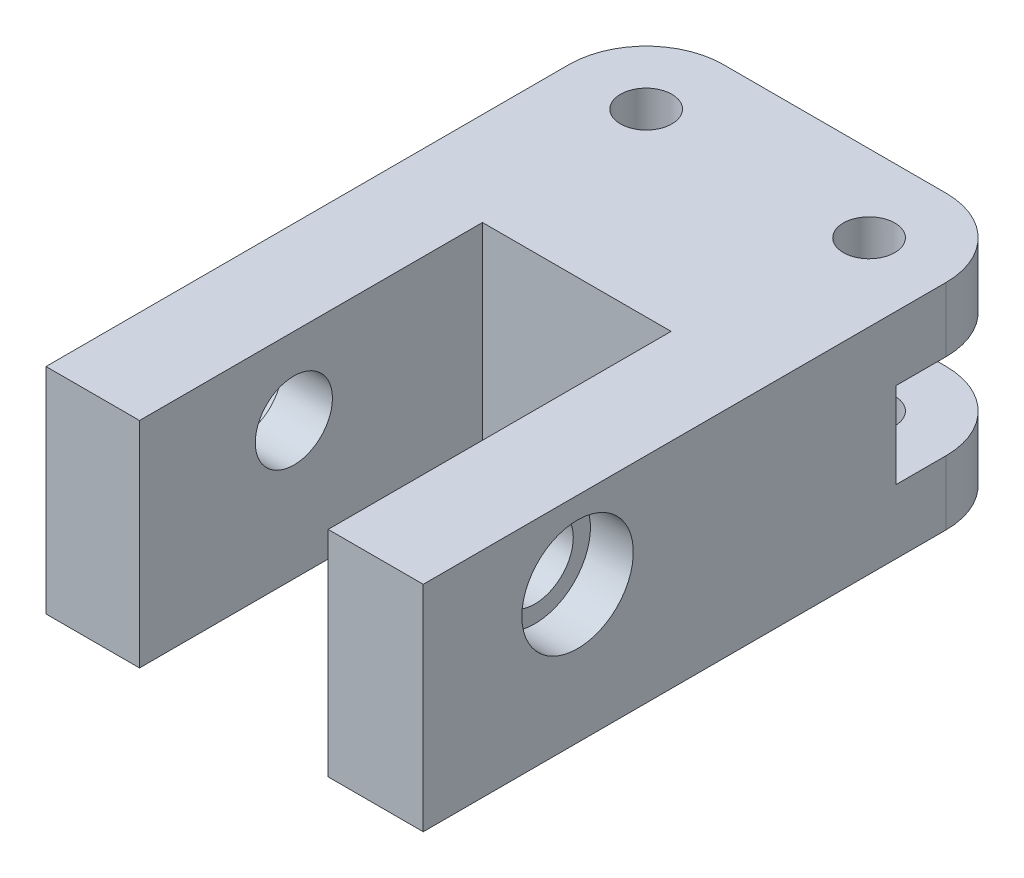
ISO-10303-21;
HEADER;
FILE_DESCRIPTION(('STEP AP214'),'2;1');
FILE_NAME('part.step','',(''),(''),'','','');
FILE_SCHEMA(('AUTOMOTIVE_DESIGN { 1 0 10303 214 1 1 1 1 }'));
ENDSEC;
DATA;
#1=APPLICATION_CONTEXT('core data for automotive mechanical design processes');
#2=APPLICATION_PROTOCOL_DEFINITION('international standard','automotive_design',2000,#1);
#3=PRODUCT_CONTEXT('',#1,'mechanical');
#4=PRODUCT('Part','Part','',(#3));
#5=PRODUCT_RELATED_PRODUCT_CATEGORY('part','',(#4));
#6=PRODUCT_DEFINITION_FORMATION('','',#4);
#7=PRODUCT_DEFINITION_CONTEXT('part definition',#1,'design');
#8=PRODUCT_DEFINITION('design','',#6,#7);
#9=PRODUCT_DEFINITION_SHAPE('','',#8);
#10=(LENGTH_UNIT() NAMED_UNIT(*) SI_UNIT(.MILLI.,.METRE.));
#11=(NAMED_UNIT(*) PLANE_ANGLE_UNIT() SI_UNIT($,.RADIAN.));
#12=(NAMED_UNIT(*) SI_UNIT($,.STERADIAN.) SOLID_ANGLE_UNIT());
#13=UNCERTAINTY_MEASURE_WITH_UNIT(LENGTH_MEASURE(1.E-05),#10,'distance_accuracy_value','');
#14=(GEOMETRIC_REPRESENTATION_CONTEXT(3) GLOBAL_UNCERTAINTY_ASSIGNED_CONTEXT((#13)) GLOBAL_UNIT_ASSIGNED_CONTEXT((#10,
#11,#12)) REPRESENTATION_CONTEXT('',''));
#15=CARTESIAN_POINT('',(0.,0.,0.));
#16=DIRECTION('',(0.,0.,1.));
#17=DIRECTION('',(1.,0.,0.));
#18=AXIS2_PLACEMENT_3D('',#15,#16,#17);
#19=CARTESIAN_POINT('',(-22.,-12.5,70.));
#20=DIRECTION('',(1.,0.,0.));
#21=DIRECTION('',(0.,0.,-1.));
#22=AXIS2_PLACEMENT_3D('',#19,#20,#21);
#23=PLANE('',#22);
#24=CARTESIAN_POINT('',(-22.,3.5,52.));
#25=DIRECTION('',(-1.,0.,0.));
#26=DIRECTION('',(0.,0.,1.));
#27=AXIS2_PLACEMENT_3D('',#24,#25,#26);
#28=CIRCLE('',#27,6.49999999999999);
#29=CARTESIAN_POINT('',(-22.,3.5,58.5));
#30=VERTEX_POINT('',#29);
#31=EDGE_CURVE('E288',#30,#30,#28,.T.);
#32=ORIENTED_EDGE('',*,*,#31,.F.);
#33=EDGE_LOOP('',(#32));
#34=FACE_BOUND('',#33,.T.);
#35=DIRECTION('',(0.,0.,1.));
#36=VECTOR('',#35,1.);
#37=CARTESIAN_POINT('',(-22.,5.,14.8492424049175));
#38=LINE('',#37,#36);
#39=CARTESIAN_POINT('',(-22.,5.,9.));
#40=VERTEX_POINT('',#39);
#41=CARTESIAN_POINT('',(-22.,5.,14.8492424049175));
#42=VERTEX_POINT('',#41);
#43=EDGE_CURVE('E242',#40,#42,#38,.T.);
#44=ORIENTED_EDGE('',*,*,#43,.T.);
#45=DIRECTION('',(0.,-1.,0.));
#46=VECTOR('',#45,1.);
#47=CARTESIAN_POINT('',(-22.,5.,14.8492424049175));
#48=LINE('',#47,#46);
#49=CARTESIAN_POINT('',(-22.,-5.,14.8492424049175));
#50=VERTEX_POINT('',#49);
#51=EDGE_CURVE('E245',#42,#50,#48,.T.);
#52=ORIENTED_EDGE('',*,*,#51,.T.);
#53=DIRECTION('',(0.,0.,1.));
#54=VECTOR('',#53,1.);
#55=CARTESIAN_POINT('',(-22.,-5.,14.8492424049175));
#56=LINE('',#55,#54);
#57=CARTESIAN_POINT('',(-22.,-5.,9.));
#58=VERTEX_POINT('',#57);
#59=EDGE_CURVE('E232',#58,#50,#56,.T.);
#60=ORIENTED_EDGE('',*,*,#59,.F.);
#61=DIRECTION('',(0.,1.,0.));
#62=VECTOR('',#61,1.);
#63=CARTESIAN_POINT('',(-22.,-16.5,9.));
#64=LINE('',#63,#62);
#65=CARTESIAN_POINT('',(-22.,-12.5,9.));
#66=VERTEX_POINT('',#65);
#67=EDGE_CURVE('E275',#66,#58,#64,.T.);
#68=ORIENTED_EDGE('',*,*,#67,.F.);
#69=DIRECTION('',(0.,0.,-1.));
#70=VECTOR('',#69,1.);
#71=CARTESIAN_POINT('',(-22.,-12.5,70.));
#72=LINE('',#71,#70);
#73=CARTESIAN_POINT('',(-22.,-12.5,70.));
#74=VERTEX_POINT('',#73);
#75=EDGE_CURVE('E363',#74,#66,#72,.T.);
#76=ORIENTED_EDGE('',*,*,#75,.F.);
#77=DIRECTION('',(0.,-1.,0.));
#78=VECTOR('',#77,1.);
#79=CARTESIAN_POINT('',(-22.,-12.5,70.));
#80=LINE('',#79,#78);
#81=CARTESIAN_POINT('',(-22.,12.5,70.));
#82=VERTEX_POINT('',#81);
#83=EDGE_CURVE('E351',#82,#74,#80,.T.);
#84=ORIENTED_EDGE('',*,*,#83,.F.);
#85=DIRECTION('',(0.,0.,-1.));
#86=VECTOR('',#85,1.);
#87=CARTESIAN_POINT('',(-22.,12.5,70.));
#88=LINE('',#87,#86);
#89=CARTESIAN_POINT('',(-22.,12.5,9.));
#90=VERTEX_POINT('',#89);
#91=EDGE_CURVE('E366',#82,#90,#88,.T.);
#92=ORIENTED_EDGE('',*,*,#91,.T.);
#93=EDGE_CURVE('E274',#40,#90,#64,.T.);
#94=ORIENTED_EDGE('',*,*,#93,.F.);
#95=EDGE_LOOP('',(#44,#52,#60,#68,#76,#84,#92,#94));
#96=FACE_BOUND('',#95,.T.);
#97=ADVANCED_FACE('F34',(#34,#96),#23,.F.);
#98=CARTESIAN_POINT('',(0.,0.,0.));
#99=DIRECTION('',(0.,0.,-1.));
#100=DIRECTION('',(-1.,0.,0.));
#101=AXIS2_PLACEMENT_3D('',#98,#99,#100);
#102=PLANE('',#101);
#103=DIRECTION('',(0.,1.,0.));
#104=VECTOR('',#103,1.);
#105=CARTESIAN_POINT('',(13.,0.,0.));
#106=LINE('',#105,#104);
#107=CARTESIAN_POINT('',(13.,5.,0.));
#108=VERTEX_POINT('',#107);
#109=CARTESIAN_POINT('',(13.,12.5,0.));
#110=VERTEX_POINT('',#109);
#111=EDGE_CURVE('E372',#108,#110,#106,.T.);
#112=ORIENTED_EDGE('',*,*,#111,.F.);
#113=DIRECTION('',(-1.,0.,0.));
#114=VECTOR('',#113,1.);
#115=CARTESIAN_POINT('',(0.,5.,0.));
#116=LINE('',#115,#114);
#117=CARTESIAN_POINT('',(2.5,5.,0.));
#118=VERTEX_POINT('',#117);
#119=EDGE_CURVE('E268',#108,#118,#116,.T.);
#120=ORIENTED_EDGE('',*,*,#119,.T.);
#121=DIRECTION('',(0.,-1.,0.));
#122=VECTOR('',#121,1.);
#123=CARTESIAN_POINT('',(2.5,0.,0.));
#124=LINE('',#123,#122);
#125=CARTESIAN_POINT('',(2.5,-5.,0.));
#126=VERTEX_POINT('',#125);
#127=EDGE_CURVE('E11',#118,#126,#124,.T.);
#128=ORIENTED_EDGE('',*,*,#127,.T.);
#129=DIRECTION('',(-1.,0.,0.));
#130=VECTOR('',#129,1.);
#131=CARTESIAN_POINT('',(0.,-5.,0.));
#132=LINE('',#131,#130);
#133=CARTESIAN_POINT('',(13.,-5.,0.));
#134=VERTEX_POINT('',#133);
#135=EDGE_CURVE('E191',#134,#126,#132,.T.);
#136=ORIENTED_EDGE('',*,*,#135,.F.);
#137=CARTESIAN_POINT('',(13.,-12.5,0.));
#138=VERTEX_POINT('',#137);
#139=EDGE_CURVE('E377',#138,#134,#106,.T.);
#140=ORIENTED_EDGE('',*,*,#139,.F.);
#141=DIRECTION('',(1.,0.,0.));
#142=VECTOR('',#141,1.);
#143=CARTESIAN_POINT('',(-22.,-12.5,0.));
#144=LINE('',#143,#142);
#145=CARTESIAN_POINT('',(-13.,-12.5,0.));
#146=VERTEX_POINT('',#145);
#147=EDGE_CURVE('E347',#146,#138,#144,.T.);
#148=ORIENTED_EDGE('',*,*,#147,.F.);
#149=DIRECTION('',(0.,1.,0.));
#150=VECTOR('',#149,1.);
#151=CARTESIAN_POINT('',(-13.,0.,0.));
#152=LINE('',#151,#150);
#153=CARTESIAN_POINT('',(-13.,-5.,0.));
#154=VERTEX_POINT('',#153);
#155=EDGE_CURVE('E385',#146,#154,#152,.T.);
#156=ORIENTED_EDGE('',*,*,#155,.T.);
#157=DIRECTION('',(-1.,0.,0.));
#158=VECTOR('',#157,1.);
#159=CARTESIAN_POINT('',(0.,-5.,0.));
#160=LINE('',#159,#158);
#161=CARTESIAN_POINT('',(-2.5,-5.,0.));
#162=VERTEX_POINT('',#161);
#163=EDGE_CURVE('E57',#162,#154,#160,.T.);
#164=ORIENTED_EDGE('',*,*,#163,.F.);
#165=DIRECTION('',(0.,1.,0.));
#166=VECTOR('',#165,1.);
#167=CARTESIAN_POINT('',(-2.5,0.,0.));
#168=LINE('',#167,#166);
#169=CARTESIAN_POINT('',(-2.5,5.,0.));
#170=VERTEX_POINT('',#169);
#171=EDGE_CURVE('E42',#162,#170,#168,.T.);
#172=ORIENTED_EDGE('',*,*,#171,.T.);
#173=DIRECTION('',(-1.,0.,0.));
#174=VECTOR('',#173,1.);
#175=CARTESIAN_POINT('',(0.,5.,0.));
#176=LINE('',#175,#174);
#177=CARTESIAN_POINT('',(-13.,5.,0.));
#178=VERTEX_POINT('',#177);
#179=EDGE_CURVE('E258',#170,#178,#176,.T.);
#180=ORIENTED_EDGE('',*,*,#179,.T.);
#181=CARTESIAN_POINT('',(-13.,12.5,0.));
#182=VERTEX_POINT('',#181);
#183=EDGE_CURVE('E380',#178,#182,#152,.T.);
#184=ORIENTED_EDGE('',*,*,#183,.T.);
#185=DIRECTION('',(-1.,0.,0.));
#186=VECTOR('',#185,1.);
#187=CARTESIAN_POINT('',(-22.,12.5,0.));
#188=LINE('',#187,#186);
#189=EDGE_CURVE('E335',#110,#182,#188,.T.);
#190=ORIENTED_EDGE('',*,*,#189,.F.);
#191=EDGE_LOOP('',(#112,#120,#128,#136,#140,#148,#156,#164,#172,#180,#184,#190));
#192=FACE_BOUND('',#191,.T.);
#193=ADVANCED_FACE('F400',(#192),#102,.T.);
#194=CARTESIAN_POINT('',(22.,-12.5,70.));
#195=DIRECTION('',(-1.,0.,0.));
#196=DIRECTION('',(0.,0.,1.));
#197=AXIS2_PLACEMENT_3D('',#194,#195,#196);
#198=PLANE('',#197);
#199=CARTESIAN_POINT('',(22.,3.5,52.));
#200=DIRECTION('',(-1.,0.,0.));
#201=DIRECTION('',(0.,0.,1.));
#202=AXIS2_PLACEMENT_3D('',#199,#200,#201);
#203=CIRCLE('',#202,6.49999999999999);
#204=CARTESIAN_POINT('',(22.,3.5,58.5));
#205=VERTEX_POINT('',#204);
#206=EDGE_CURVE('E309',#205,#205,#203,.T.);
#207=ORIENTED_EDGE('',*,*,#206,.T.);
#208=EDGE_LOOP('',(#207));
#209=FACE_BOUND('',#208,.T.);
#210=DIRECTION('',(0.,0.,-1.));
#211=VECTOR('',#210,1.);
#212=CARTESIAN_POINT('',(22.,5.,14.8492424049175));
#213=LINE('',#212,#211);
#214=CARTESIAN_POINT('',(22.,5.,14.8492424049175));
#215=VERTEX_POINT('',#214);
#216=CARTESIAN_POINT('',(22.,5.,9.));
#217=VERTEX_POINT('',#216);
#218=EDGE_CURVE('E218',#215,#217,#213,.T.);
#219=ORIENTED_EDGE('',*,*,#218,.T.);
#220=DIRECTION('',(0.,1.,0.));
#221=VECTOR('',#220,1.);
#222=CARTESIAN_POINT('',(22.,-16.5,9.));
#223=LINE('',#222,#221);
#224=CARTESIAN_POINT('',(22.,12.5,9.));
#225=VERTEX_POINT('',#224);
#226=EDGE_CURVE('E294',#217,#225,#223,.T.);
#227=ORIENTED_EDGE('',*,*,#226,.T.);
#228=DIRECTION('',(0.,0.,-1.));
#229=VECTOR('',#228,1.);
#230=CARTESIAN_POINT('',(22.,12.5,70.));
#231=LINE('',#230,#229);
#232=CARTESIAN_POINT('',(22.,12.5,70.));
#233=VERTEX_POINT('',#232);
#234=EDGE_CURVE('E369',#233,#225,#231,.T.);
#235=ORIENTED_EDGE('',*,*,#234,.F.);
#236=DIRECTION('',(0.,1.,0.));
#237=VECTOR('',#236,1.);
#238=CARTESIAN_POINT('',(22.,-12.5,70.));
#239=LINE('',#238,#237);
#240=CARTESIAN_POINT('',(22.,-12.5,70.));
#241=VERTEX_POINT('',#240);
#242=EDGE_CURVE('E343',#241,#233,#239,.T.);
#243=ORIENTED_EDGE('',*,*,#242,.F.);
#244=DIRECTION('',(0.,0.,-1.));
#245=VECTOR('',#244,1.);
#246=CARTESIAN_POINT('',(22.,-12.5,70.));
#247=LINE('',#246,#245);
#248=CARTESIAN_POINT('',(22.,-12.5,9.));
#249=VERTEX_POINT('',#248);
#250=EDGE_CURVE('E357',#241,#249,#247,.T.);
#251=ORIENTED_EDGE('',*,*,#250,.T.);
#252=CARTESIAN_POINT('',(22.,-5.,9.));
#253=VERTEX_POINT('',#252);
#254=EDGE_CURVE('E295',#249,#253,#223,.T.);
#255=ORIENTED_EDGE('',*,*,#254,.T.);
#256=DIRECTION('',(0.,0.,-1.));
#257=VECTOR('',#256,1.);
#258=CARTESIAN_POINT('',(22.,-5.,14.8492424049175));
#259=LINE('',#258,#257);
#260=CARTESIAN_POINT('',(22.,-5.,14.8492424049175));
#261=VERTEX_POINT('',#260);
#262=EDGE_CURVE('E49',#261,#253,#259,.T.);
#263=ORIENTED_EDGE('',*,*,#262,.F.);
#264=DIRECTION('',(0.,-1.,0.));
#265=VECTOR('',#264,1.);
#266=CARTESIAN_POINT('',(22.,5.,14.8492424049175));
#267=LINE('',#266,#265);
#268=EDGE_CURVE('E221',#215,#261,#267,.T.);
#269=ORIENTED_EDGE('',*,*,#268,.F.);
#270=EDGE_LOOP('',(#219,#227,#235,#243,#251,#255,#263,#269));
#271=FACE_BOUND('',#270,.T.);
#272=ADVANCED_FACE('F36',(#209,#271),#198,.F.);
#273=CARTESIAN_POINT('',(13.,-16.5,9.));
#274=DIRECTION('',(0.,1.,0.));
#275=DIRECTION('',(0.,0.,1.));
#276=AXIS2_PLACEMENT_3D('',#273,#274,#275);
#277=CYLINDRICAL_SURFACE('',#276,9.);
#278=CARTESIAN_POINT('',(13.,5.,9.));
#279=DIRECTION('',(0.,-1.,0.));
#280=DIRECTION('',(0.,0.,-1.));
#281=AXIS2_PLACEMENT_3D('',#278,#279,#280);
#282=CIRCLE('',#281,9.);
#283=EDGE_CURVE('E266',#108,#217,#282,.T.);
#284=ORIENTED_EDGE('',*,*,#283,.F.);
#285=ORIENTED_EDGE('',*,*,#111,.T.);
#286=CARTESIAN_POINT('',(13.,12.5,9.));
#287=DIRECTION('',(0.,-1.,0.));
#288=DIRECTION('',(0.,0.,1.));
#289=AXIS2_PLACEMENT_3D('',#286,#287,#288);
#290=CIRCLE('',#289,9.);
#291=EDGE_CURVE('E291',#110,#225,#290,.T.);
#292=ORIENTED_EDGE('',*,*,#291,.T.);
#293=ORIENTED_EDGE('',*,*,#226,.F.);
#294=EDGE_LOOP('',(#284,#285,#292,#293));
#295=FACE_BOUND('',#294,.T.);
#296=ADVANCED_FACE('F434',(#295),#277,.T.);
#297=CARTESIAN_POINT('',(13.,-16.5,9.));
#298=DIRECTION('',(0.,1.,0.));
#299=DIRECTION('',(0.,0.,1.));
#300=AXIS2_PLACEMENT_3D('',#297,#298,#299);
#301=CYLINDRICAL_SURFACE('',#300,3.);
#302=CARTESIAN_POINT('',(13.,12.5,9.));
#303=DIRECTION('',(0.,1.,0.));
#304=DIRECTION('',(0.,0.,1.));
#305=AXIS2_PLACEMENT_3D('',#302,#303,#304);
#306=CIRCLE('',#305,3.);
#307=CARTESIAN_POINT('',(13.,12.5,12.));
#308=VERTEX_POINT('',#307);
#309=EDGE_CURVE('E298',#308,#308,#306,.T.);
#310=ORIENTED_EDGE('',*,*,#309,.T.);
#311=EDGE_LOOP('',(#310));
#312=FACE_BOUND('',#311,.T.);
#313=CARTESIAN_POINT('',(13.,5.,9.));
#314=DIRECTION('',(0.,-1.,0.));
#315=DIRECTION('',(0.,0.,-1.));
#316=AXIS2_PLACEMENT_3D('',#313,#314,#315);
#317=CIRCLE('',#316,3.);
#318=CARTESIAN_POINT('',(13.,5.,6.00000000000001));
#319=VERTEX_POINT('',#318);
#320=EDGE_CURVE('E265',#319,#319,#317,.F.);
#321=ORIENTED_EDGE('',*,*,#320,.F.);
#322=EDGE_LOOP('',(#321));
#323=FACE_BOUND('',#322,.T.);
#324=ADVANCED_FACE('F540',(#312,#323),#301,.F.);
#325=CARTESIAN_POINT('',(-13.,-16.5,9.));
#326=DIRECTION('',(0.,1.,0.));
#327=DIRECTION('',(0.,0.,1.));
#328=AXIS2_PLACEMENT_3D('',#325,#326,#327);
#329=CYLINDRICAL_SURFACE('',#328,9.);
#330=ORIENTED_EDGE('',*,*,#183,.F.);
#331=CARTESIAN_POINT('',(-13.,5.,9.));
#332=DIRECTION('',(0.,-1.,0.));
#333=DIRECTION('',(0.,0.,-1.));
#334=AXIS2_PLACEMENT_3D('',#331,#332,#333);
#335=CIRCLE('',#334,9.);
#336=EDGE_CURVE('E255',#178,#40,#335,.F.);
#337=ORIENTED_EDGE('',*,*,#336,.T.);
#338=ORIENTED_EDGE('',*,*,#93,.T.);
#339=CARTESIAN_POINT('',(-13.,12.5,9.));
#340=DIRECTION('',(0.,1.,0.));
#341=DIRECTION('',(0.,0.,1.));
#342=AXIS2_PLACEMENT_3D('',#339,#340,#341);
#343=CIRCLE('',#342,9.);
#344=EDGE_CURVE('E271',#182,#90,#343,.T.);
#345=ORIENTED_EDGE('',*,*,#344,.F.);
#346=EDGE_LOOP('',(#330,#337,#338,#345));
#347=FACE_BOUND('',#346,.T.);
#348=ADVANCED_FACE('F419',(#347),#329,.T.);
#349=CARTESIAN_POINT('',(-13.,-16.5,9.));
#350=DIRECTION('',(0.,1.,0.));
#351=DIRECTION('',(0.,0.,1.));
#352=AXIS2_PLACEMENT_3D('',#349,#350,#351);
#353=CYLINDRICAL_SURFACE('',#352,3.);
#354=CARTESIAN_POINT('',(-13.,12.5,9.));
#355=DIRECTION('',(0.,-1.,0.));
#356=DIRECTION('',(0.,0.,1.));
#357=AXIS2_PLACEMENT_3D('',#354,#355,#356);
#358=CIRCLE('',#357,3.);
#359=CARTESIAN_POINT('',(-13.,12.5,12.));
#360=VERTEX_POINT('',#359);
#361=EDGE_CURVE('E278',#360,#360,#358,.T.);
#362=ORIENTED_EDGE('',*,*,#361,.F.);
#363=EDGE_LOOP('',(#362));
#364=FACE_BOUND('',#363,.T.);
#365=CARTESIAN_POINT('',(-13.,5.,9.));
#366=DIRECTION('',(0.,-1.,0.));
#367=DIRECTION('',(0.,0.,-1.));
#368=AXIS2_PLACEMENT_3D('',#365,#366,#367);
#369=CIRCLE('',#368,3.);
#370=CARTESIAN_POINT('',(-13.,5.,6.00000000000001));
#371=VERTEX_POINT('',#370);
#372=EDGE_CURVE('E254',#371,#371,#369,.T.);
#373=ORIENTED_EDGE('',*,*,#372,.T.);
#374=EDGE_LOOP('',(#373));
#375=FACE_BOUND('',#374,.T.);
#376=ADVANCED_FACE('F471',(#364,#375),#353,.F.);
#377=CARTESIAN_POINT('',(0.,0.,70.));
#378=DIRECTION('',(0.,0.,-1.));
#379=DIRECTION('',(-1.,0.,0.));
#380=AXIS2_PLACEMENT_3D('',#377,#378,#379);
#381=PLANE('',#380);
#382=DIRECTION('',(1.,0.,0.));
#383=VECTOR('',#382,1.);
#384=CARTESIAN_POINT('',(-22.,-12.5,70.));
#385=LINE('',#384,#383);
#386=CARTESIAN_POINT('',(-11.0921363727812,-12.5,70.));
#387=VERTEX_POINT('',#386);
#388=EDGE_CURVE('E354',#74,#387,#385,.T.);
#389=ORIENTED_EDGE('',*,*,#388,.T.);
#390=DIRECTION('',(0.,-1.,0.));
#391=VECTOR('',#390,1.);
#392=CARTESIAN_POINT('',(-11.0921363727812,-12.5,70.));
#393=LINE('',#392,#391);
#394=CARTESIAN_POINT('',(-11.0921363727812,12.5,70.));
#395=VERTEX_POINT('',#394);
#396=EDGE_CURVE('E315',#395,#387,#393,.T.);
#397=ORIENTED_EDGE('',*,*,#396,.F.);
#398=DIRECTION('',(-1.,0.,0.));
#399=VECTOR('',#398,1.);
#400=CARTESIAN_POINT('',(-22.,12.5,70.));
#401=LINE('',#400,#399);
#402=EDGE_CURVE('E346',#395,#82,#401,.T.);
#403=ORIENTED_EDGE('',*,*,#402,.T.);
#404=ORIENTED_EDGE('',*,*,#83,.T.);
#405=EDGE_LOOP('',(#389,#397,#403,#404));
#406=FACE_BOUND('',#405,.T.);
#407=ADVANCED_FACE('F464',(#406),#381,.F.);
#408=CARTESIAN_POINT('',(-22.,12.5,70.));
#409=DIRECTION('',(0.,-1.,0.));
#410=DIRECTION('',(0.,0.,-1.));
#411=AXIS2_PLACEMENT_3D('',#408,#409,#410);
#412=PLANE('',#411);
#413=ORIENTED_EDGE('',*,*,#344,.T.);
#414=ORIENTED_EDGE('',*,*,#91,.F.);
#415=ORIENTED_EDGE('',*,*,#402,.F.);
#416=DIRECTION('',(0.,0.,1.));
#417=VECTOR('',#416,1.);
#418=CARTESIAN_POINT('',(-11.0921363727812,12.5,30.));
#419=LINE('',#418,#417);
#420=CARTESIAN_POINT('',(-11.0921363727812,12.5,30.));
#421=VERTEX_POINT('',#420);
#422=EDGE_CURVE('E333',#421,#395,#419,.T.);
#423=ORIENTED_EDGE('',*,*,#422,.F.);
#424=DIRECTION('',(-1.,0.,0.));
#425=VECTOR('',#424,1.);
#426=CARTESIAN_POINT('',(-11.0921363727812,12.5,30.));
#427=LINE('',#426,#425);
#428=CARTESIAN_POINT('',(10.9078636272188,12.5,30.));
#429=VERTEX_POINT('',#428);
#430=EDGE_CURVE('E327',#429,#421,#427,.T.);
#431=ORIENTED_EDGE('',*,*,#430,.F.);
#432=DIRECTION('',(0.,0.,1.));
#433=VECTOR('',#432,1.);
#434=CARTESIAN_POINT('',(10.9078636272188,12.5,30.));
#435=LINE('',#434,#433);
#436=CARTESIAN_POINT('',(10.9078636272188,12.5,70.));
#437=VERTEX_POINT('',#436);
#438=EDGE_CURVE('E336',#429,#437,#435,.T.);
#439=ORIENTED_EDGE('',*,*,#438,.T.);
#440=EDGE_CURVE('E348',#233,#437,#401,.T.);
#441=ORIENTED_EDGE('',*,*,#440,.F.);
#442=ORIENTED_EDGE('',*,*,#234,.T.);
#443=ORIENTED_EDGE('',*,*,#291,.F.);
#444=ORIENTED_EDGE('',*,*,#189,.T.);
#445=EDGE_LOOP('',(#413,#414,#415,#423,#431,#439,#441,#442,#443,#444));
#446=FACE_BOUND('',#445,.T.);
#447=ORIENTED_EDGE('',*,*,#361,.T.);
#448=EDGE_LOOP('',(#447));
#449=FACE_BOUND('',#448,.T.);
#450=ORIENTED_EDGE('',*,*,#309,.F.);
#451=EDGE_LOOP('',(#450));
#452=FACE_BOUND('',#451,.T.);
#453=ADVANCED_FACE('F427',(#446,#449,#452),#412,.F.);
#454=CARTESIAN_POINT('',(-22.,-12.5,70.));
#455=DIRECTION('',(0.,1.,0.));
#456=DIRECTION('',(0.,0.,1.));
#457=AXIS2_PLACEMENT_3D('',#454,#455,#456);
#458=PLANE('',#457);
#459=CARTESIAN_POINT('',(-13.,-12.5,9.));
#460=DIRECTION('',(0.,1.,0.));
#461=DIRECTION('',(0.,0.,1.));
#462=AXIS2_PLACEMENT_3D('',#459,#460,#461);
#463=CIRCLE('',#462,9.);
#464=EDGE_CURVE('E281',#146,#66,#463,.T.);
#465=ORIENTED_EDGE('',*,*,#464,.F.);
#466=ORIENTED_EDGE('',*,*,#147,.T.);
#467=CARTESIAN_POINT('',(13.,-12.5,9.));
#468=DIRECTION('',(0.,1.,0.));
#469=DIRECTION('',(0.,0.,1.));
#470=AXIS2_PLACEMENT_3D('',#467,#468,#469);
#471=CIRCLE('',#470,9.);
#472=EDGE_CURVE('E301',#138,#249,#471,.F.);
#473=ORIENTED_EDGE('',*,*,#472,.T.);
#474=ORIENTED_EDGE('',*,*,#250,.F.);
#475=CARTESIAN_POINT('',(10.9078636272188,-12.5,70.));
#476=VERTEX_POINT('',#475);
#477=EDGE_CURVE('E353',#476,#241,#385,.T.);
#478=ORIENTED_EDGE('',*,*,#477,.F.);
#479=DIRECTION('',(0.,0.,1.));
#480=VECTOR('',#479,1.);
#481=CARTESIAN_POINT('',(10.9078636272188,-12.5,30.));
#482=LINE('',#481,#480);
#483=CARTESIAN_POINT('',(10.9078636272188,-12.5,30.));
#484=VERTEX_POINT('',#483);
#485=EDGE_CURVE('E339',#484,#476,#482,.T.);
#486=ORIENTED_EDGE('',*,*,#485,.F.);
#487=DIRECTION('',(1.,0.,0.));
#488=VECTOR('',#487,1.);
#489=CARTESIAN_POINT('',(-11.0921363727812,-12.5,30.));
#490=LINE('',#489,#488);
#491=CARTESIAN_POINT('',(-11.0921363727812,-12.5,30.));
#492=VERTEX_POINT('',#491);
#493=EDGE_CURVE('E320',#492,#484,#490,.T.);
#494=ORIENTED_EDGE('',*,*,#493,.F.);
#495=DIRECTION('',(0.,0.,1.));
#496=VECTOR('',#495,1.);
#497=CARTESIAN_POINT('',(-11.0921363727812,-12.5,30.));
#498=LINE('',#497,#496);
#499=EDGE_CURVE('E330',#492,#387,#498,.T.);
#500=ORIENTED_EDGE('',*,*,#499,.T.);
#501=ORIENTED_EDGE('',*,*,#388,.F.);
#502=ORIENTED_EDGE('',*,*,#75,.T.);
#503=EDGE_LOOP('',(#465,#466,#473,#474,#478,#486,#494,#500,#501,#502));
#504=FACE_BOUND('',#503,.T.);
#505=CARTESIAN_POINT('',(-13.,-12.5,9.));
#506=DIRECTION('',(0.,1.,0.));
#507=DIRECTION('',(0.,0.,1.));
#508=AXIS2_PLACEMENT_3D('',#505,#506,#507);
#509=CIRCLE('',#508,3.);
#510=CARTESIAN_POINT('',(-13.,-12.5,12.));
#511=VERTEX_POINT('',#510);
#512=EDGE_CURVE('E283',#511,#511,#509,.F.);
#513=ORIENTED_EDGE('',*,*,#512,.F.);
#514=EDGE_LOOP('',(#513));
#515=FACE_BOUND('',#514,.T.);
#516=CARTESIAN_POINT('',(13.,-12.5,9.));
#517=DIRECTION('',(0.,1.,0.));
#518=DIRECTION('',(0.,0.,1.));
#519=AXIS2_PLACEMENT_3D('',#516,#517,#518);
#520=CIRCLE('',#519,3.);
#521=CARTESIAN_POINT('',(13.,-12.5,12.));
#522=VERTEX_POINT('',#521);
#523=EDGE_CURVE('E304',#522,#522,#520,.T.);
#524=ORIENTED_EDGE('',*,*,#523,.T.);
#525=EDGE_LOOP('',(#524));
#526=FACE_BOUND('',#525,.T.);
#527=ADVANCED_FACE('F462',(#504,#515,#526),#458,.F.);
#528=ORIENTED_EDGE('',*,*,#440,.T.);
#529=DIRECTION('',(0.,1.,0.));
#530=VECTOR('',#529,1.);
#531=CARTESIAN_POINT('',(10.9078636272188,-12.5,70.));
#532=LINE('',#531,#530);
#533=EDGE_CURVE('E321',#476,#437,#532,.T.);
#534=ORIENTED_EDGE('',*,*,#533,.F.);
#535=ORIENTED_EDGE('',*,*,#477,.T.);
#536=ORIENTED_EDGE('',*,*,#242,.T.);
#537=EDGE_LOOP('',(#528,#534,#535,#536));
#538=FACE_BOUND('',#537,.T.);
#539=ADVANCED_FACE('F469',(#538),#381,.F.);
#540=CARTESIAN_POINT('',(-11.0921363727812,-12.5,30.));
#541=DIRECTION('',(-1.,0.,0.));
#542=DIRECTION('',(0.,0.,1.));
#543=AXIS2_PLACEMENT_3D('',#540,#541,#542);
#544=PLANE('',#543);
#545=CARTESIAN_POINT('',(-11.0921363727812,3.5,52.));
#546=DIRECTION('',(-1.,0.,0.));
#547=DIRECTION('',(0.,0.,1.));
#548=AXIS2_PLACEMENT_3D('',#545,#546,#547);
#549=CIRCLE('',#548,4.5);
#550=CARTESIAN_POINT('',(-11.0921363727812,3.5,56.5));
#551=VERTEX_POINT('',#550);
#552=EDGE_CURVE('E312',#551,#551,#549,.T.);
#553=ORIENTED_EDGE('',*,*,#552,.T.);
#554=EDGE_LOOP('',(#553));
#555=FACE_BOUND('',#554,.T.);
#556=ORIENTED_EDGE('',*,*,#396,.T.);
#557=ORIENTED_EDGE('',*,*,#499,.F.);
#558=DIRECTION('',(0.,-1.,0.));
#559=VECTOR('',#558,1.);
#560=CARTESIAN_POINT('',(-11.0921363727812,-12.5,30.));
#561=LINE('',#560,#559);
#562=EDGE_CURVE('E317',#421,#492,#561,.T.);
#563=ORIENTED_EDGE('',*,*,#562,.F.);
#564=ORIENTED_EDGE('',*,*,#422,.T.);
#565=EDGE_LOOP('',(#556,#557,#563,#564));
#566=FACE_BOUND('',#565,.T.);
#567=ADVANCED_FACE('F482',(#555,#566),#544,.F.);
#568=CARTESIAN_POINT('',(10.9078636272188,-12.5,30.));
#569=DIRECTION('',(1.,0.,0.));
#570=DIRECTION('',(0.,0.,-1.));
#571=AXIS2_PLACEMENT_3D('',#568,#569,#570);
#572=PLANE('',#571);
#573=CARTESIAN_POINT('',(10.9078636272188,3.5,52.));
#574=DIRECTION('',(1.,0.,0.));
#575=DIRECTION('',(0.,0.,-1.));
#576=AXIS2_PLACEMENT_3D('',#573,#574,#575);
#577=CIRCLE('',#576,4.5);
#578=CARTESIAN_POINT('',(10.9078636272188,3.5,47.5));
#579=VERTEX_POINT('',#578);
#580=EDGE_CURVE('E316',#579,#579,#577,.T.);
#581=ORIENTED_EDGE('',*,*,#580,.T.);
#582=EDGE_LOOP('',(#581));
#583=FACE_BOUND('',#582,.T.);
#584=ORIENTED_EDGE('',*,*,#533,.T.);
#585=ORIENTED_EDGE('',*,*,#438,.F.);
#586=DIRECTION('',(0.,1.,0.));
#587=VECTOR('',#586,1.);
#588=CARTESIAN_POINT('',(10.9078636272188,-12.5,30.));
#589=LINE('',#588,#587);
#590=EDGE_CURVE('E324',#484,#429,#589,.T.);
#591=ORIENTED_EDGE('',*,*,#590,.F.);
#592=ORIENTED_EDGE('',*,*,#485,.T.);
#593=EDGE_LOOP('',(#584,#585,#591,#592));
#594=FACE_BOUND('',#593,.T.);
#595=ADVANCED_FACE('F487',(#583,#594),#572,.F.);
#596=CARTESIAN_POINT('',(0.,0.,30.));
#597=DIRECTION('',(0.,0.,-1.));
#598=DIRECTION('',(-1.,0.,0.));
#599=AXIS2_PLACEMENT_3D('',#596,#597,#598);
#600=PLANE('',#599);
#601=ORIENTED_EDGE('',*,*,#562,.T.);
#602=ORIENTED_EDGE('',*,*,#493,.T.);
#603=ORIENTED_EDGE('',*,*,#590,.T.);
#604=ORIENTED_EDGE('',*,*,#430,.T.);
#605=EDGE_LOOP('',(#601,#602,#603,#604));
#606=FACE_BOUND('',#605,.T.);
#607=ADVANCED_FACE('F495',(#606),#600,.F.);
#608=CARTESIAN_POINT('',(-28.,3.5,52.));
#609=DIRECTION('',(1.,0.,0.));
#610=DIRECTION('',(0.,0.,-1.));
#611=AXIS2_PLACEMENT_3D('',#608,#609,#610);
#612=CYLINDRICAL_SURFACE('',#611,4.5);
#613=CARTESIAN_POINT('',(17.,3.5,52.));
#614=DIRECTION('',(-1.,0.,0.));
#615=DIRECTION('',(0.,0.,1.));
#616=AXIS2_PLACEMENT_3D('',#613,#614,#615);
#617=CIRCLE('',#616,4.5);
#618=CARTESIAN_POINT('',(17.,3.5,56.5));
#619=VERTEX_POINT('',#618);
#620=EDGE_CURVE('E308',#619,#619,#617,.F.);
#621=ORIENTED_EDGE('',*,*,#620,.T.);
#622=EDGE_LOOP('',(#621));
#623=FACE_BOUND('',#622,.T.);
#624=ORIENTED_EDGE('',*,*,#580,.F.);
#625=EDGE_LOOP('',(#624));
#626=FACE_BOUND('',#625,.T.);
#627=ADVANCED_FACE('F551',(#623,#626),#612,.F.);
#628=CARTESIAN_POINT('',(-17.,3.5,52.));
#629=DIRECTION('',(1.,0.,0.));
#630=DIRECTION('',(0.,0.,-1.));
#631=AXIS2_PLACEMENT_3D('',#628,#629,#630);
#632=CIRCLE('',#631,4.5);
#633=CARTESIAN_POINT('',(-17.,3.5,47.5));
#634=VERTEX_POINT('',#633);
#635=EDGE_CURVE('E287',#634,#634,#632,.F.);
#636=ORIENTED_EDGE('',*,*,#635,.T.);
#637=EDGE_LOOP('',(#636));
#638=FACE_BOUND('',#637,.T.);
#639=ORIENTED_EDGE('',*,*,#552,.F.);
#640=EDGE_LOOP('',(#639));
#641=FACE_BOUND('',#640,.T.);
#642=ADVANCED_FACE('F544',(#638,#641),#612,.F.);
#643=CARTESIAN_POINT('',(17.,3.5,52.));
#644=DIRECTION('',(-1.,0.,0.));
#645=DIRECTION('',(0.,0.,1.));
#646=AXIS2_PLACEMENT_3D('',#643,#644,#645);
#647=PLANE('',#646);
#648=CARTESIAN_POINT('',(17.,3.5,52.));
#649=DIRECTION('',(-1.,0.,0.));
#650=DIRECTION('',(0.,0.,1.));
#651=AXIS2_PLACEMENT_3D('',#648,#649,#650);
#652=CIRCLE('',#651,6.49999999999999);
#653=CARTESIAN_POINT('',(17.,3.5,58.5));
#654=VERTEX_POINT('',#653);
#655=EDGE_CURVE('E305',#654,#654,#652,.T.);
#656=ORIENTED_EDGE('',*,*,#655,.F.);
#657=EDGE_LOOP('',(#656));
#658=FACE_BOUND('',#657,.T.);
#659=ORIENTED_EDGE('',*,*,#620,.F.);
#660=EDGE_LOOP('',(#659));
#661=FACE_BOUND('',#660,.T.);
#662=ADVANCED_FACE('F541',(#658,#661),#647,.F.);
#663=CARTESIAN_POINT('',(17.,3.5,52.));
#664=DIRECTION('',(1.,0.,0.));
#665=DIRECTION('',(0.,0.,-1.));
#666=AXIS2_PLACEMENT_3D('',#663,#664,#665);
#667=CYLINDRICAL_SURFACE('',#666,6.49999999999999);
#668=ORIENTED_EDGE('',*,*,#655,.T.);
#669=EDGE_LOOP('',(#668));
#670=FACE_BOUND('',#669,.T.);
#671=ORIENTED_EDGE('',*,*,#206,.F.);
#672=EDGE_LOOP('',(#671));
#673=FACE_BOUND('',#672,.T.);
#674=ADVANCED_FACE('F536',(#670,#673),#667,.F.);
#675=ORIENTED_EDGE('',*,*,#139,.T.);
#676=CARTESIAN_POINT('',(13.,-5.,9.));
#677=DIRECTION('',(0.,-1.,0.));
#678=DIRECTION('',(0.,0.,-1.));
#679=AXIS2_PLACEMENT_3D('',#676,#677,#678);
#680=CIRCLE('',#679,9.);
#681=EDGE_CURVE('E262',#134,#253,#680,.T.);
#682=ORIENTED_EDGE('',*,*,#681,.T.);
#683=ORIENTED_EDGE('',*,*,#254,.F.);
#684=ORIENTED_EDGE('',*,*,#472,.F.);
#685=EDGE_LOOP('',(#675,#682,#683,#684));
#686=FACE_BOUND('',#685,.T.);
#687=ADVANCED_FACE('F503',(#686),#277,.T.);
#688=CARTESIAN_POINT('',(13.,-5.,9.));
#689=DIRECTION('',(0.,-1.,0.));
#690=DIRECTION('',(0.,0.,-1.));
#691=AXIS2_PLACEMENT_3D('',#688,#689,#690);
#692=CIRCLE('',#691,3.);
#693=CARTESIAN_POINT('',(13.,-5.,6.00000000000001));
#694=VERTEX_POINT('',#693);
#695=EDGE_CURVE('E261',#694,#694,#692,.F.);
#696=ORIENTED_EDGE('',*,*,#695,.T.);
#697=EDGE_LOOP('',(#696));
#698=FACE_BOUND('',#697,.T.);
#699=ORIENTED_EDGE('',*,*,#523,.F.);
#700=EDGE_LOOP('',(#699));
#701=FACE_BOUND('',#700,.T.);
#702=ADVANCED_FACE('F529',(#698,#701),#301,.F.);
#703=CARTESIAN_POINT('',(-17.,3.5,52.));
#704=DIRECTION('',(1.,0.,0.));
#705=DIRECTION('',(0.,0.,1.));
#706=AXIS2_PLACEMENT_3D('',#703,#704,#705);
#707=PLANE('',#706);
#708=CARTESIAN_POINT('',(-17.,3.5,52.));
#709=DIRECTION('',(-1.,0.,0.));
#710=DIRECTION('',(0.,0.,1.));
#711=AXIS2_PLACEMENT_3D('',#708,#709,#710);
#712=CIRCLE('',#711,6.49999999999999);
#713=CARTESIAN_POINT('',(-17.,3.5,58.5));
#714=VERTEX_POINT('',#713);
#715=EDGE_CURVE('E284',#714,#714,#712,.T.);
#716=ORIENTED_EDGE('',*,*,#715,.T.);
#717=EDGE_LOOP('',(#716));
#718=FACE_BOUND('',#717,.T.);
#719=ORIENTED_EDGE('',*,*,#635,.F.);
#720=EDGE_LOOP('',(#719));
#721=FACE_BOUND('',#720,.T.);
#722=ADVANCED_FACE('F526',(#718,#721),#707,.F.);
#723=CARTESIAN_POINT('',(-17.,3.5,52.));
#724=DIRECTION('',(-1.,0.,0.));
#725=DIRECTION('',(0.,0.,1.));
#726=AXIS2_PLACEMENT_3D('',#723,#724,#725);
#727=CYLINDRICAL_SURFACE('',#726,6.49999999999999);
#728=ORIENTED_EDGE('',*,*,#715,.F.);
#729=EDGE_LOOP('',(#728));
#730=FACE_BOUND('',#729,.T.);
#731=ORIENTED_EDGE('',*,*,#31,.T.);
#732=EDGE_LOOP('',(#731));
#733=FACE_BOUND('',#732,.T.);
#734=ADVANCED_FACE('F524',(#730,#733),#727,.F.);
#735=CARTESIAN_POINT('',(-13.,-5.,9.));
#736=DIRECTION('',(0.,-1.,0.));
#737=DIRECTION('',(0.,0.,-1.));
#738=AXIS2_PLACEMENT_3D('',#735,#736,#737);
#739=CIRCLE('',#738,9.);
#740=EDGE_CURVE('E251',#154,#58,#739,.F.);
#741=ORIENTED_EDGE('',*,*,#740,.F.);
#742=ORIENTED_EDGE('',*,*,#155,.F.);
#743=ORIENTED_EDGE('',*,*,#464,.T.);
#744=ORIENTED_EDGE('',*,*,#67,.T.);
#745=EDGE_LOOP('',(#741,#742,#743,#744));
#746=FACE_BOUND('',#745,.T.);
#747=ADVANCED_FACE('F509',(#746),#329,.T.);
#748=CARTESIAN_POINT('',(-13.,-5.,9.));
#749=DIRECTION('',(0.,-1.,0.));
#750=DIRECTION('',(0.,0.,-1.));
#751=AXIS2_PLACEMENT_3D('',#748,#749,#750);
#752=CIRCLE('',#751,3.);
#753=CARTESIAN_POINT('',(-13.,-5.,6.00000000000001));
#754=VERTEX_POINT('',#753);
#755=EDGE_CURVE('E202',#754,#754,#752,.T.);
#756=ORIENTED_EDGE('',*,*,#755,.F.);
#757=EDGE_LOOP('',(#756));
#758=FACE_BOUND('',#757,.T.);
#759=ORIENTED_EDGE('',*,*,#512,.T.);
#760=EDGE_LOOP('',(#759));
#761=FACE_BOUND('',#760,.T.);
#762=ADVANCED_FACE('F479',(#758,#761),#353,.F.);
#763=CARTESIAN_POINT('',(-17.3492424049175,5.,19.5));
#764=DIRECTION('',(0.707106781186549,0.,-0.707106781186546));
#765=DIRECTION('',(-0.707106781186546,0.,-0.707106781186549));
#766=AXIS2_PLACEMENT_3D('',#763,#764,#765);
#767=PLANE('',#766);
#768=ORIENTED_EDGE('',*,*,#51,.F.);
#769=DIRECTION('',(0.707106781186546,0.,0.707106781186549));
#770=VECTOR('',#769,1.);
#771=CARTESIAN_POINT('',(-17.3492424049175,5.,19.5));
#772=LINE('',#771,#770);
#773=CARTESIAN_POINT('',(-17.3492424049175,5.,19.5));
#774=VERTEX_POINT('',#773);
#775=EDGE_CURVE('E234',#42,#774,#772,.T.);
#776=ORIENTED_EDGE('',*,*,#775,.T.);
#777=DIRECTION('',(0.,-1.,0.));
#778=VECTOR('',#777,1.);
#779=CARTESIAN_POINT('',(-17.3492424049175,5.,19.5));
#780=LINE('',#779,#778);
#781=CARTESIAN_POINT('',(-17.3492424049175,-5.,19.5));
#782=VERTEX_POINT('',#781);
#783=EDGE_CURVE('E193',#774,#782,#780,.T.);
#784=ORIENTED_EDGE('',*,*,#783,.T.);
#785=DIRECTION('',(0.707106781186546,0.,0.707106781186549));
#786=VECTOR('',#785,1.);
#787=CARTESIAN_POINT('',(-17.3492424049175,-5.,19.5));
#788=LINE('',#787,#786);
#789=EDGE_CURVE('E224',#50,#782,#788,.T.);
#790=ORIENTED_EDGE('',*,*,#789,.F.);
#791=EDGE_LOOP('',(#768,#776,#784,#790));
#792=FACE_BOUND('',#791,.T.);
#793=ADVANCED_FACE('F512',(#792),#767,.T.);
#794=CARTESIAN_POINT('',(-17.3492424049175,5.,19.5));
#795=DIRECTION('',(0.,0.,-1.));
#796=DIRECTION('',(-1.,0.,0.));
#797=AXIS2_PLACEMENT_3D('',#794,#795,#796);
#798=PLANE('',#797);
#799=ORIENTED_EDGE('',*,*,#783,.F.);
#800=DIRECTION('',(1.,0.,0.));
#801=VECTOR('',#800,1.);
#802=CARTESIAN_POINT('',(-17.3492424049175,5.,19.5));
#803=LINE('',#802,#801);
#804=CARTESIAN_POINT('',(-2.5,5.,19.5));
#805=VERTEX_POINT('',#804);
#806=EDGE_CURVE('E237',#774,#805,#803,.T.);
#807=ORIENTED_EDGE('',*,*,#806,.T.);
#808=DIRECTION('',(0.,-1.,0.));
#809=VECTOR('',#808,1.);
#810=CARTESIAN_POINT('',(-2.5,5.,19.5));
#811=LINE('',#810,#809);
#812=CARTESIAN_POINT('',(-2.5,-5.,19.5));
#813=VERTEX_POINT('',#812);
#814=EDGE_CURVE('E248',#805,#813,#811,.T.);
#815=ORIENTED_EDGE('',*,*,#814,.T.);
#816=DIRECTION('',(1.,0.,0.));
#817=VECTOR('',#816,1.);
#818=CARTESIAN_POINT('',(-17.3492424049175,-5.,19.5));
#819=LINE('',#818,#817);
#820=EDGE_CURVE('E227',#782,#813,#819,.T.);
#821=ORIENTED_EDGE('',*,*,#820,.F.);
#822=EDGE_LOOP('',(#799,#807,#815,#821));
#823=FACE_BOUND('',#822,.T.);
#824=ADVANCED_FACE('F413',(#823),#798,.T.);
#825=CARTESIAN_POINT('',(-2.5,5.,19.5));
#826=DIRECTION('',(-1.,0.,0.));
#827=DIRECTION('',(0.,0.,1.));
#828=AXIS2_PLACEMENT_3D('',#825,#826,#827);
#829=PLANE('',#828);
#830=DIRECTION('',(0.,0.,-1.));
#831=VECTOR('',#830,1.);
#832=CARTESIAN_POINT('',(-2.5,-5.,19.5));
#833=LINE('',#832,#831);
#834=EDGE_CURVE('E230',#813,#162,#833,.T.);
#835=ORIENTED_EDGE('',*,*,#834,.F.);
#836=ORIENTED_EDGE('',*,*,#814,.F.);
#837=DIRECTION('',(0.,0.,-1.));
#838=VECTOR('',#837,1.);
#839=CARTESIAN_POINT('',(-2.5,5.,19.5));
#840=LINE('',#839,#838);
#841=EDGE_CURVE('E239',#805,#170,#840,.T.);
#842=ORIENTED_EDGE('',*,*,#841,.T.);
#843=ORIENTED_EDGE('',*,*,#171,.F.);
#844=EDGE_LOOP('',(#835,#836,#842,#843));
#845=FACE_BOUND('',#844,.T.);
#846=ADVANCED_FACE('F404',(#845),#829,.T.);
#847=CARTESIAN_POINT('',(0.,5.,0.));
#848=DIRECTION('',(0.,-1.,0.));
#849=DIRECTION('',(0.,0.,-1.));
#850=AXIS2_PLACEMENT_3D('',#847,#848,#849);
#851=PLANE('',#850);
#852=ORIENTED_EDGE('',*,*,#372,.F.);
#853=EDGE_LOOP('',(#852));
#854=FACE_BOUND('',#853,.T.);
#855=ORIENTED_EDGE('',*,*,#841,.F.);
#856=ORIENTED_EDGE('',*,*,#806,.F.);
#857=ORIENTED_EDGE('',*,*,#775,.F.);
#858=ORIENTED_EDGE('',*,*,#43,.F.);
#859=ORIENTED_EDGE('',*,*,#336,.F.);
#860=ORIENTED_EDGE('',*,*,#179,.F.);
#861=EDGE_LOOP('',(#855,#856,#857,#858,#859,#860));
#862=FACE_BOUND('',#861,.T.);
#863=ADVANCED_FACE('F415',(#854,#862),#851,.T.);
#864=CARTESIAN_POINT('',(0.,-5.,0.));
#865=DIRECTION('',(0.,-1.,0.));
#866=DIRECTION('',(0.,0.,-1.));
#867=AXIS2_PLACEMENT_3D('',#864,#865,#866);
#868=PLANE('',#867);
#869=ORIENTED_EDGE('',*,*,#163,.T.);
#870=ORIENTED_EDGE('',*,*,#740,.T.);
#871=ORIENTED_EDGE('',*,*,#59,.T.);
#872=ORIENTED_EDGE('',*,*,#789,.T.);
#873=ORIENTED_EDGE('',*,*,#820,.T.);
#874=ORIENTED_EDGE('',*,*,#834,.T.);
#875=EDGE_LOOP('',(#869,#870,#871,#872,#873,#874));
#876=FACE_BOUND('',#875,.T.);
#877=ORIENTED_EDGE('',*,*,#755,.T.);
#878=EDGE_LOOP('',(#877));
#879=FACE_BOUND('',#878,.T.);
#880=ADVANCED_FACE('F407',(#876,#879),#868,.F.);
#881=CARTESIAN_POINT('',(0.,5.,0.));
#882=DIRECTION('',(0.,-1.,0.));
#883=DIRECTION('',(0.,0.,-1.));
#884=AXIS2_PLACEMENT_3D('',#881,#882,#883);
#885=PLANE('',#884);
#886=ORIENTED_EDGE('',*,*,#283,.T.);
#887=ORIENTED_EDGE('',*,*,#218,.F.);
#888=DIRECTION('',(0.707106781186546,0.,-0.707106781186549));
#889=VECTOR('',#888,1.);
#890=CARTESIAN_POINT('',(17.3492424049175,5.,19.5));
#891=LINE('',#890,#889);
#892=CARTESIAN_POINT('',(17.3492424049175,5.,19.5));
#893=VERTEX_POINT('',#892);
#894=EDGE_CURVE('E216',#893,#215,#891,.T.);
#895=ORIENTED_EDGE('',*,*,#894,.F.);
#896=DIRECTION('',(1.,0.,0.));
#897=VECTOR('',#896,1.);
#898=CARTESIAN_POINT('',(17.3492424049175,5.,19.5));
#899=LINE('',#898,#897);
#900=CARTESIAN_POINT('',(2.5,5.,19.5));
#901=VERTEX_POINT('',#900);
#902=EDGE_CURVE('E214',#901,#893,#899,.T.);
#903=ORIENTED_EDGE('',*,*,#902,.F.);
#904=DIRECTION('',(0.,0.,1.));
#905=VECTOR('',#904,1.);
#906=CARTESIAN_POINT('',(2.5,5.,19.5));
#907=LINE('',#906,#905);
#908=EDGE_CURVE('E199',#118,#901,#907,.T.);
#909=ORIENTED_EDGE('',*,*,#908,.F.);
#910=ORIENTED_EDGE('',*,*,#119,.F.);
#911=EDGE_LOOP('',(#886,#887,#895,#903,#909,#910));
#912=FACE_BOUND('',#911,.T.);
#913=ORIENTED_EDGE('',*,*,#320,.T.);
#914=EDGE_LOOP('',(#913));
#915=FACE_BOUND('',#914,.T.);
#916=ADVANCED_FACE('F438',(#912,#915),#885,.T.);
#917=CARTESIAN_POINT('',(0.,-5.,0.));
#918=DIRECTION('',(0.,-1.,0.));
#919=DIRECTION('',(0.,0.,-1.));
#920=AXIS2_PLACEMENT_3D('',#917,#918,#919);
#921=PLANE('',#920);
#922=ORIENTED_EDGE('',*,*,#135,.T.);
#923=DIRECTION('',(0.,0.,1.));
#924=VECTOR('',#923,1.);
#925=CARTESIAN_POINT('',(2.5,-5.,19.5));
#926=LINE('',#925,#924);
#927=CARTESIAN_POINT('',(2.5,-5.,19.5));
#928=VERTEX_POINT('',#927);
#929=EDGE_CURVE('E184',#126,#928,#926,.T.);
#930=ORIENTED_EDGE('',*,*,#929,.T.);
#931=DIRECTION('',(1.,0.,0.));
#932=VECTOR('',#931,1.);
#933=CARTESIAN_POINT('',(17.3492424049175,-5.,19.5));
#934=LINE('',#933,#932);
#935=CARTESIAN_POINT('',(17.3492424049175,-5.,19.5));
#936=VERTEX_POINT('',#935);
#937=EDGE_CURVE('E189',#928,#936,#934,.T.);
#938=ORIENTED_EDGE('',*,*,#937,.T.);
#939=DIRECTION('',(0.707106781186546,0.,-0.707106781186549));
#940=VECTOR('',#939,1.);
#941=CARTESIAN_POINT('',(17.3492424049175,-5.,19.5));
#942=LINE('',#941,#940);
#943=EDGE_CURVE('E208',#936,#261,#942,.T.);
#944=ORIENTED_EDGE('',*,*,#943,.T.);
#945=ORIENTED_EDGE('',*,*,#262,.T.);
#946=ORIENTED_EDGE('',*,*,#681,.F.);
#947=EDGE_LOOP('',(#922,#930,#938,#944,#945,#946));
#948=FACE_BOUND('',#947,.T.);
#949=ORIENTED_EDGE('',*,*,#695,.F.);
#950=EDGE_LOOP('',(#949));
#951=FACE_BOUND('',#950,.T.);
#952=ADVANCED_FACE('F186',(#948,#951),#921,.F.);
#953=CARTESIAN_POINT('',(2.5,5.,19.5));
#954=DIRECTION('',(1.,0.,0.));
#955=DIRECTION('',(0.,0.,-1.));
#956=AXIS2_PLACEMENT_3D('',#953,#954,#955);
#957=PLANE('',#956);
#958=ORIENTED_EDGE('',*,*,#908,.T.);
#959=DIRECTION('',(0.,-1.,0.));
#960=VECTOR('',#959,1.);
#961=CARTESIAN_POINT('',(2.5,5.,19.5));
#962=LINE('',#961,#960);
#963=EDGE_CURVE('E196',#901,#928,#962,.T.);
#964=ORIENTED_EDGE('',*,*,#963,.T.);
#965=ORIENTED_EDGE('',*,*,#929,.F.);
#966=ORIENTED_EDGE('',*,*,#127,.F.);
#967=EDGE_LOOP('',(#958,#964,#965,#966));
#968=FACE_BOUND('',#967,.T.);
#969=ADVANCED_FACE('F197',(#968),#957,.T.);
#970=CARTESIAN_POINT('',(17.3492424049175,5.,19.5));
#971=DIRECTION('',(0.,0.,-1.));
#972=DIRECTION('',(-1.,0.,0.));
#973=AXIS2_PLACEMENT_3D('',#970,#971,#972);
#974=PLANE('',#973);
#975=ORIENTED_EDGE('',*,*,#963,.F.);
#976=ORIENTED_EDGE('',*,*,#902,.T.);
#977=DIRECTION('',(0.,-1.,0.));
#978=VECTOR('',#977,1.);
#979=CARTESIAN_POINT('',(17.3492424049175,5.,19.5));
#980=LINE('',#979,#978);
#981=EDGE_CURVE('E203',#893,#936,#980,.T.);
#982=ORIENTED_EDGE('',*,*,#981,.T.);
#983=ORIENTED_EDGE('',*,*,#937,.F.);
#984=EDGE_LOOP('',(#975,#976,#982,#983));
#985=FACE_BOUND('',#984,.T.);
#986=ADVANCED_FACE('F205',(#985),#974,.T.);
#987=CARTESIAN_POINT('',(17.3492424049175,5.,19.5));
#988=DIRECTION('',(-0.707106781186549,0.,-0.707106781186546));
#989=DIRECTION('',(-0.707106781186546,0.,0.707106781186549));
#990=AXIS2_PLACEMENT_3D('',#987,#988,#989);
#991=PLANE('',#990);
#992=ORIENTED_EDGE('',*,*,#981,.F.);
#993=ORIENTED_EDGE('',*,*,#894,.T.);
#994=ORIENTED_EDGE('',*,*,#268,.T.);
#995=ORIENTED_EDGE('',*,*,#943,.F.);
#996=EDGE_LOOP('',(#992,#993,#994,#995));
#997=FACE_BOUND('',#996,.T.);
#998=ADVANCED_FACE('F445',(#997),#991,.T.);
#999=CLOSED_SHELL('',(#97,#193,#272,#296,#324,#348,#376,#407,#453,#527,#539,#567,#595,#607,#627,
#642,#662,#674,#687,#702,#722,#734,#747,#762,#793,#824,#846,#863,#880,#916,#952,#969,#986,#998));
#1000=MANIFOLD_SOLID_BREP('B2',#999);
#1001=ADVANCED_BREP_SHAPE_REPRESENTATION('',(#18,#1000),#14);
#1002=SHAPE_DEFINITION_REPRESENTATION(#9,#1001);
ENDSEC;
END-ISO-10303-21;
